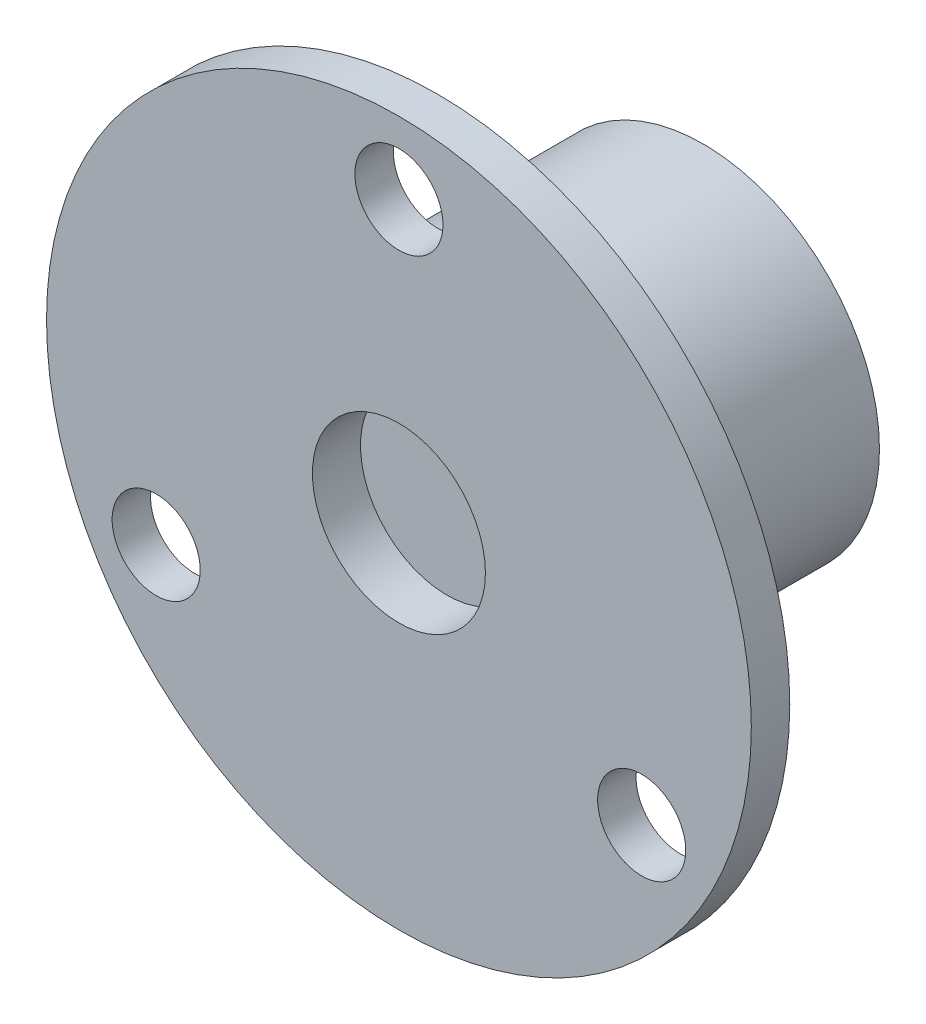
ISO-10303-21;
HEADER;
FILE_DESCRIPTION(('STEP AP214'),'2;1');
FILE_NAME('part.step','',(''),(''),'','','');
FILE_SCHEMA(('AUTOMOTIVE_DESIGN { 1 0 10303 214 1 1 1 1 }'));
ENDSEC;
DATA;
#1=APPLICATION_CONTEXT('core data for automotive mechanical design processes');
#2=APPLICATION_PROTOCOL_DEFINITION('international standard','automotive_design',2000,#1);
#3=PRODUCT_CONTEXT('',#1,'mechanical');
#4=PRODUCT('Part','Part','',(#3));
#5=PRODUCT_RELATED_PRODUCT_CATEGORY('part','',(#4));
#6=PRODUCT_DEFINITION_FORMATION('','',#4);
#7=PRODUCT_DEFINITION_CONTEXT('part definition',#1,'design');
#8=PRODUCT_DEFINITION('design','',#6,#7);
#9=PRODUCT_DEFINITION_SHAPE('','',#8);
#10=(LENGTH_UNIT() NAMED_UNIT(*) SI_UNIT(.MILLI.,.METRE.));
#11=(NAMED_UNIT(*) PLANE_ANGLE_UNIT() SI_UNIT($,.RADIAN.));
#12=(NAMED_UNIT(*) SI_UNIT($,.STERADIAN.) SOLID_ANGLE_UNIT());
#13=UNCERTAINTY_MEASURE_WITH_UNIT(LENGTH_MEASURE(1.E-05),#10,'distance_accuracy_value','');
#14=(GEOMETRIC_REPRESENTATION_CONTEXT(3) GLOBAL_UNCERTAINTY_ASSIGNED_CONTEXT((#13)) GLOBAL_UNIT_ASSIGNED_CONTEXT((#10,
#11,#12)) REPRESENTATION_CONTEXT('',''));
#15=CARTESIAN_POINT('',(0.,0.,0.));
#16=DIRECTION('',(0.,0.,1.));
#17=DIRECTION('',(1.,0.,0.));
#18=AXIS2_PLACEMENT_3D('',#15,#16,#17);
#19=CARTESIAN_POINT('',(0.,0.,2.4));
#20=DIRECTION('',(0.,0.,1.));
#21=DIRECTION('',(1.,0.,0.));
#22=AXIS2_PLACEMENT_3D('',#19,#20,#21);
#23=PLANE('',#22);
#24=CARTESIAN_POINT('',(0.,0.,2.4));
#25=DIRECTION('',(0.,0.,1.));
#26=DIRECTION('',(1.,0.,0.));
#27=AXIS2_PLACEMENT_3D('',#24,#25,#26);
#28=CIRCLE('',#27,5.4);
#29=CARTESIAN_POINT('',(5.4,0.,2.4));
#30=VERTEX_POINT('',#29);
#31=EDGE_CURVE('E88',#30,#30,#28,.T.);
#32=ORIENTED_EDGE('',*,*,#31,.F.);
#33=EDGE_LOOP('',(#32));
#34=FACE_BOUND('',#33,.T.);
#35=CARTESIAN_POINT('',(0.,17.5,2.4));
#36=DIRECTION('',(0.,0.,1.));
#37=DIRECTION('',(1.,0.,0.));
#38=AXIS2_PLACEMENT_3D('',#35,#36,#37);
#39=CIRCLE('',#38,2.75);
#40=CARTESIAN_POINT('',(2.75,17.5,2.4));
#41=VERTEX_POINT('',#40);
#42=EDGE_CURVE('E73',#41,#41,#39,.T.);
#43=ORIENTED_EDGE('',*,*,#42,.F.);
#44=EDGE_LOOP('',(#43));
#45=FACE_BOUND('',#44,.T.);
#46=CARTESIAN_POINT('',(-15.1554445662266,-8.75000000000065,2.4));
#47=DIRECTION('',(0.,0.,1.));
#48=DIRECTION('',(1.,0.,0.));
#49=AXIS2_PLACEMENT_3D('',#46,#47,#48);
#50=CIRCLE('',#49,2.75);
#51=CARTESIAN_POINT('',(-12.4054445662266,-8.75000000000065,2.4));
#52=VERTEX_POINT('',#51);
#53=EDGE_CURVE('E69',#52,#52,#50,.T.);
#54=ORIENTED_EDGE('',*,*,#53,.F.);
#55=EDGE_LOOP('',(#54));
#56=FACE_BOUND('',#55,.T.);
#57=CARTESIAN_POINT('',(15.1554445662288,-8.74999999999935,2.4));
#58=DIRECTION('',(0.,0.,1.));
#59=DIRECTION('',(1.,0.,0.));
#60=AXIS2_PLACEMENT_3D('',#57,#58,#59);
#61=CIRCLE('',#60,2.75);
#62=CARTESIAN_POINT('',(17.9054445662288,-8.74999999999935,2.4));
#63=VERTEX_POINT('',#62);
#64=EDGE_CURVE('E60',#63,#63,#61,.T.);
#65=ORIENTED_EDGE('',*,*,#64,.F.);
#66=EDGE_LOOP('',(#65));
#67=FACE_BOUND('',#66,.T.);
#68=CARTESIAN_POINT('',(0.,0.,2.4));
#69=DIRECTION('',(0.,0.,1.));
#70=DIRECTION('',(1.,0.,0.));
#71=AXIS2_PLACEMENT_3D('',#68,#69,#70);
#72=CIRCLE('',#71,22.);
#73=CARTESIAN_POINT('',(22.,0.,2.4));
#74=VERTEX_POINT('',#73);
#75=EDGE_CURVE('E10',#74,#74,#72,.T.);
#76=ORIENTED_EDGE('',*,*,#75,.T.);
#77=EDGE_LOOP('',(#76));
#78=FACE_BOUND('',#77,.T.);
#79=ADVANCED_FACE('F41',(#34,#45,#56,#67,#78),#23,.T.);
#80=CARTESIAN_POINT('',(0.,0.,0.));
#81=DIRECTION('',(0.,0.,1.));
#82=DIRECTION('',(1.,0.,0.));
#83=AXIS2_PLACEMENT_3D('',#80,#81,#82);
#84=PLANE('',#83);
#85=CARTESIAN_POINT('',(0.,17.5,0.));
#86=DIRECTION('',(0.,0.,1.));
#87=DIRECTION('',(1.,0.,0.));
#88=AXIS2_PLACEMENT_3D('',#85,#86,#87);
#89=CIRCLE('',#88,2.75);
#90=CARTESIAN_POINT('',(2.75,17.5,0.));
#91=VERTEX_POINT('',#90);
#92=EDGE_CURVE('E54',#91,#91,#89,.T.);
#93=ORIENTED_EDGE('',*,*,#92,.T.);
#94=EDGE_LOOP('',(#93));
#95=FACE_BOUND('',#94,.T.);
#96=CARTESIAN_POINT('',(-15.1554445662266,-8.75000000000065,0.));
#97=DIRECTION('',(0.,0.,1.));
#98=DIRECTION('',(1.,0.,0.));
#99=AXIS2_PLACEMENT_3D('',#96,#97,#98);
#100=CIRCLE('',#99,2.75);
#101=CARTESIAN_POINT('',(-12.4054445662266,-8.75000000000065,0.));
#102=VERTEX_POINT('',#101);
#103=EDGE_CURVE('E65',#102,#102,#100,.T.);
#104=ORIENTED_EDGE('',*,*,#103,.T.);
#105=EDGE_LOOP('',(#104));
#106=FACE_BOUND('',#105,.T.);
#107=CARTESIAN_POINT('',(15.1554445662288,-8.74999999999935,0.));
#108=DIRECTION('',(0.,0.,1.));
#109=DIRECTION('',(1.,0.,0.));
#110=AXIS2_PLACEMENT_3D('',#107,#108,#109);
#111=CIRCLE('',#110,2.75);
#112=CARTESIAN_POINT('',(17.9054445662288,-8.74999999999935,0.));
#113=VERTEX_POINT('',#112);
#114=EDGE_CURVE('E56',#113,#113,#111,.T.);
#115=ORIENTED_EDGE('',*,*,#114,.T.);
#116=EDGE_LOOP('',(#115));
#117=FACE_BOUND('',#116,.T.);
#118=CARTESIAN_POINT('',(0.,0.,0.));
#119=DIRECTION('',(0.,0.,1.));
#120=DIRECTION('',(1.,0.,0.));
#121=AXIS2_PLACEMENT_3D('',#118,#119,#120);
#122=CIRCLE('',#121,22.);
#123=CARTESIAN_POINT('',(22.,0.,0.));
#124=VERTEX_POINT('',#123);
#125=EDGE_CURVE('E45',#124,#124,#122,.T.);
#126=ORIENTED_EDGE('',*,*,#125,.F.);
#127=EDGE_LOOP('',(#126));
#128=FACE_BOUND('',#127,.T.);
#129=CARTESIAN_POINT('',(0.,0.,0.));
#130=DIRECTION('',(0.,0.,1.));
#131=DIRECTION('',(1.,0.,0.));
#132=AXIS2_PLACEMENT_3D('',#129,#130,#131);
#133=CIRCLE('',#132,11.);
#134=CARTESIAN_POINT('',(11.,0.,0.));
#135=VERTEX_POINT('',#134);
#136=EDGE_CURVE('E61',#135,#135,#133,.T.);
#137=ORIENTED_EDGE('',*,*,#136,.T.);
#138=EDGE_LOOP('',(#137));
#139=FACE_BOUND('',#138,.T.);
#140=ADVANCED_FACE('F107',(#95,#106,#117,#128,#139),#84,.F.);
#141=CARTESIAN_POINT('',(0.,0.,2.4));
#142=DIRECTION('',(0.,0.,-1.));
#143=DIRECTION('',(-1.,0.,0.));
#144=AXIS2_PLACEMENT_3D('',#141,#142,#143);
#145=CYLINDRICAL_SURFACE('',#144,22.);
#146=ORIENTED_EDGE('',*,*,#75,.F.);
#147=EDGE_LOOP('',(#146));
#148=FACE_BOUND('',#147,.T.);
#149=ORIENTED_EDGE('',*,*,#125,.T.);
#150=EDGE_LOOP('',(#149));
#151=FACE_BOUND('',#150,.T.);
#152=ADVANCED_FACE('F43',(#148,#151),#145,.T.);
#153=CARTESIAN_POINT('',(15.1554445662288,-8.74999999999935,0.));
#154=DIRECTION('',(0.,0.,1.));
#155=DIRECTION('',(1.,0.,0.));
#156=AXIS2_PLACEMENT_3D('',#153,#154,#155);
#157=CYLINDRICAL_SURFACE('',#156,2.75);
#158=ORIENTED_EDGE('',*,*,#114,.F.);
#159=EDGE_LOOP('',(#158));
#160=FACE_BOUND('',#159,.T.);
#161=ORIENTED_EDGE('',*,*,#64,.T.);
#162=EDGE_LOOP('',(#161));
#163=FACE_BOUND('',#162,.T.);
#164=ADVANCED_FACE('F115',(#160,#163),#157,.F.);
#165=CARTESIAN_POINT('',(-15.1554445662266,-8.75000000000065,0.));
#166=DIRECTION('',(0.,0.,1.));
#167=DIRECTION('',(1.,0.,0.));
#168=AXIS2_PLACEMENT_3D('',#165,#166,#167);
#169=CYLINDRICAL_SURFACE('',#168,2.75);
#170=ORIENTED_EDGE('',*,*,#103,.F.);
#171=EDGE_LOOP('',(#170));
#172=FACE_BOUND('',#171,.T.);
#173=ORIENTED_EDGE('',*,*,#53,.T.);
#174=EDGE_LOOP('',(#173));
#175=FACE_BOUND('',#174,.T.);
#176=ADVANCED_FACE('F117',(#172,#175),#169,.F.);
#177=CARTESIAN_POINT('',(0.,17.5,0.));
#178=DIRECTION('',(0.,0.,1.));
#179=DIRECTION('',(1.,0.,0.));
#180=AXIS2_PLACEMENT_3D('',#177,#178,#179);
#181=CYLINDRICAL_SURFACE('',#180,2.75);
#182=ORIENTED_EDGE('',*,*,#92,.F.);
#183=EDGE_LOOP('',(#182));
#184=FACE_BOUND('',#183,.T.);
#185=ORIENTED_EDGE('',*,*,#42,.T.);
#186=EDGE_LOOP('',(#185));
#187=FACE_BOUND('',#186,.T.);
#188=ADVANCED_FACE('F124',(#184,#187),#181,.F.);
#189=CARTESIAN_POINT('',(0.,0.,-16.6));
#190=DIRECTION('',(0.,0.,1.));
#191=DIRECTION('',(1.,0.,0.));
#192=AXIS2_PLACEMENT_3D('',#189,#190,#191);
#193=CYLINDRICAL_SURFACE('',#192,11.);
#194=CARTESIAN_POINT('',(0.,0.,-16.6));
#195=DIRECTION('',(0.,0.,1.));
#196=DIRECTION('',(1.,0.,0.));
#197=AXIS2_PLACEMENT_3D('',#194,#195,#196);
#198=CIRCLE('',#197,11.);
#199=CARTESIAN_POINT('',(11.,0.,-16.6));
#200=VERTEX_POINT('',#199);
#201=EDGE_CURVE('E83',#200,#200,#198,.T.);
#202=ORIENTED_EDGE('',*,*,#201,.T.);
#203=EDGE_LOOP('',(#202));
#204=FACE_BOUND('',#203,.T.);
#205=ORIENTED_EDGE('',*,*,#136,.F.);
#206=EDGE_LOOP('',(#205));
#207=FACE_BOUND('',#206,.T.);
#208=ADVANCED_FACE('F143',(#204,#207),#193,.T.);
#209=CARTESIAN_POINT('',(0.,0.,-16.6));
#210=DIRECTION('',(0.,0.,1.));
#211=DIRECTION('',(1.,0.,0.));
#212=AXIS2_PLACEMENT_3D('',#209,#210,#211);
#213=PLANE('',#212);
#214=ORIENTED_EDGE('',*,*,#201,.F.);
#215=EDGE_LOOP('',(#214));
#216=FACE_BOUND('',#215,.T.);
#217=ADVANCED_FACE('F101',(#216),#213,.F.);
#218=CARTESIAN_POINT('',(0.,0.,-0.6));
#219=DIRECTION('',(0.,0.,1.));
#220=DIRECTION('',(1.,0.,0.));
#221=AXIS2_PLACEMENT_3D('',#218,#219,#220);
#222=CYLINDRICAL_SURFACE('',#221,5.4);
#223=CARTESIAN_POINT('',(0.,0.,-0.6));
#224=DIRECTION('',(0.,0.,1.));
#225=DIRECTION('',(1.,0.,0.));
#226=AXIS2_PLACEMENT_3D('',#223,#224,#225);
#227=CIRCLE('',#226,5.4);
#228=CARTESIAN_POINT('',(5.4,0.,-0.6));
#229=VERTEX_POINT('',#228);
#230=EDGE_CURVE('E87',#229,#229,#227,.T.);
#231=ORIENTED_EDGE('',*,*,#230,.F.);
#232=EDGE_LOOP('',(#231));
#233=FACE_BOUND('',#232,.T.);
#234=ORIENTED_EDGE('',*,*,#31,.T.);
#235=EDGE_LOOP('',(#234));
#236=FACE_BOUND('',#235,.T.);
#237=ADVANCED_FACE('F98',(#233,#236),#222,.F.);
#238=CARTESIAN_POINT('',(0.,0.,-0.6));
#239=DIRECTION('',(0.,0.,1.));
#240=DIRECTION('',(1.,0.,0.));
#241=AXIS2_PLACEMENT_3D('',#238,#239,#240);
#242=PLANE('',#241);
#243=ORIENTED_EDGE('',*,*,#230,.T.);
#244=EDGE_LOOP('',(#243));
#245=FACE_BOUND('',#244,.T.);
#246=ADVANCED_FACE('F96',(#245),#242,.T.);
#247=CLOSED_SHELL('',(#79,#140,#152,#164,#176,#188,#208,#217,#237,#246));
#248=MANIFOLD_SOLID_BREP('B2',#247);
#249=ADVANCED_BREP_SHAPE_REPRESENTATION('',(#18,#248),#14);
#250=SHAPE_DEFINITION_REPRESENTATION(#9,#249);
ENDSEC;
END-ISO-10303-21;
